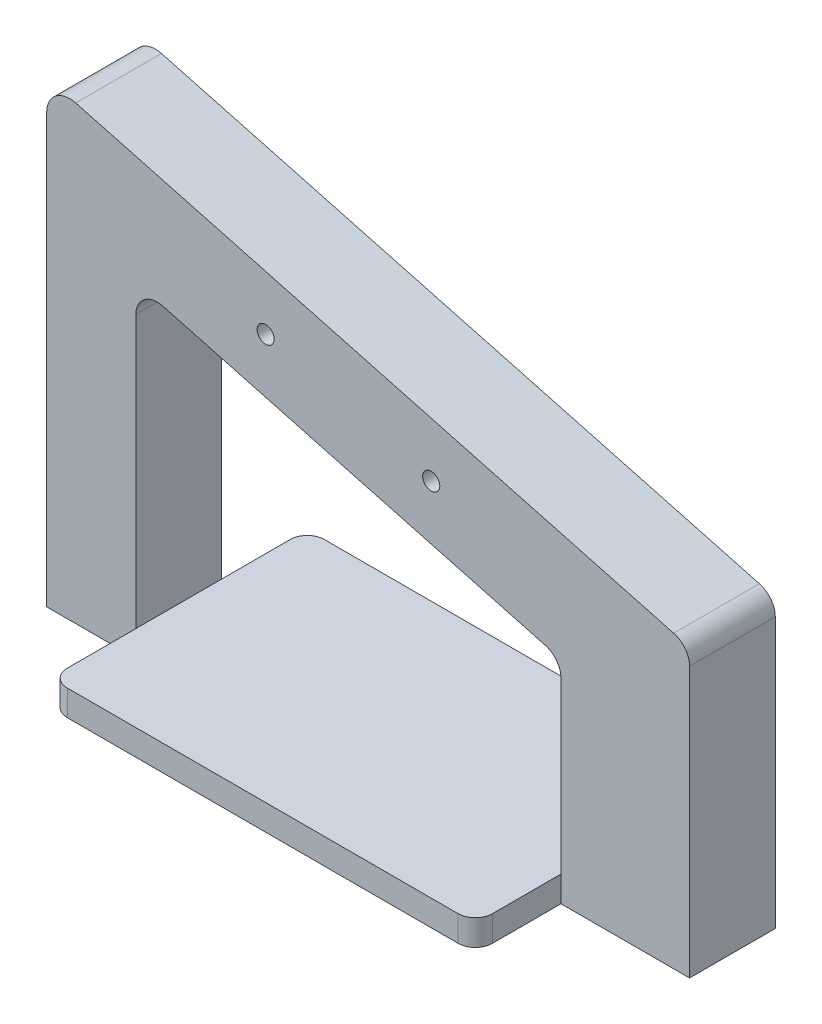
ISO-10303-21;
HEADER;
FILE_DESCRIPTION(('STEP AP214'),'2;1');
FILE_NAME('part.step','',(''),(''),'','','');
FILE_SCHEMA(('AUTOMOTIVE_DESIGN { 1 0 10303 214 1 1 1 1 }'));
ENDSEC;
DATA;
#1=APPLICATION_CONTEXT('core data for automotive mechanical design processes');
#2=APPLICATION_PROTOCOL_DEFINITION('international standard','automotive_design',2000,#1);
#3=PRODUCT_CONTEXT('',#1,'mechanical');
#4=PRODUCT('Part','Part','',(#3));
#5=PRODUCT_RELATED_PRODUCT_CATEGORY('part','',(#4));
#6=PRODUCT_DEFINITION_FORMATION('','',#4);
#7=PRODUCT_DEFINITION_CONTEXT('part definition',#1,'design');
#8=PRODUCT_DEFINITION('design','',#6,#7);
#9=PRODUCT_DEFINITION_SHAPE('','',#8);
#10=(LENGTH_UNIT() NAMED_UNIT(*) SI_UNIT(.MILLI.,.METRE.));
#11=(NAMED_UNIT(*) PLANE_ANGLE_UNIT() SI_UNIT($,.RADIAN.));
#12=(NAMED_UNIT(*) SI_UNIT($,.STERADIAN.) SOLID_ANGLE_UNIT());
#13=UNCERTAINTY_MEASURE_WITH_UNIT(LENGTH_MEASURE(1.E-05),#10,'distance_accuracy_value','');
#14=(GEOMETRIC_REPRESENTATION_CONTEXT(3) GLOBAL_UNCERTAINTY_ASSIGNED_CONTEXT((#13)) GLOBAL_UNIT_ASSIGNED_CONTEXT((#10,
#11,#12)) REPRESENTATION_CONTEXT('',''));
#15=CARTESIAN_POINT('',(0.,0.,0.));
#16=DIRECTION('',(0.,0.,1.));
#17=DIRECTION('',(1.,0.,0.));
#18=AXIS2_PLACEMENT_3D('',#15,#16,#17);
#19=CARTESIAN_POINT('',(82.55,72.3797208240468,25.4));
#20=DIRECTION('',(0.,0.,-1.));
#21=DIRECTION('',(-1.,0.,0.));
#22=AXIS2_PLACEMENT_3D('',#19,#20,#21);
#23=PLANE('',#22);
#24=CARTESIAN_POINT('',(-36.7282723305372,94.7545594602727,25.4));
#25=DIRECTION('',(0.,0.,1.));
#26=DIRECTION('',(1.,0.,0.));
#27=AXIS2_PLACEMENT_3D('',#24,#25,#26);
#28=CIRCLE('',#27,2.54);
#29=CARTESIAN_POINT('',(-34.1882723305372,94.7545594602727,25.4));
#30=VERTEX_POINT('',#29);
#31=EDGE_CURVE('E361',#30,#30,#28,.T.);
#32=ORIENTED_EDGE('',*,*,#31,.F.);
#33=EDGE_LOOP('',(#32));
#34=FACE_BOUND('',#33,.T.);
#35=CARTESIAN_POINT('',(12.3407596449475,81.606551969065,25.4));
#36=DIRECTION('',(0.,0.,1.));
#37=DIRECTION('',(1.,0.,0.));
#38=AXIS2_PLACEMENT_3D('',#35,#36,#37);
#39=CIRCLE('',#38,2.54);
#40=CARTESIAN_POINT('',(14.8807596449475,81.606551969065,25.4));
#41=VERTEX_POINT('',#40);
#42=EDGE_CURVE('E365',#41,#41,#39,.T.);
#43=ORIENTED_EDGE('',*,*,#42,.F.);
#44=EDGE_LOOP('',(#43));
#45=FACE_BOUND('',#44,.T.);
#46=DIRECTION('',(0.,1.,0.));
#47=VECTOR('',#46,1.);
#48=CARTESIAN_POINT('',(50.8,0.,25.4));
#49=LINE('',#48,#47);
#50=CARTESIAN_POINT('',(50.8,-7.61999999999999,25.4));
#51=VERTEX_POINT('',#50);
#52=CARTESIAN_POINT('',(50.8,0.,25.4));
#53=VERTEX_POINT('',#52);
#54=EDGE_CURVE('E240',#51,#53,#49,.T.);
#55=ORIENTED_EDGE('',*,*,#54,.F.);
#56=DIRECTION('',(1.,0.,0.));
#57=VECTOR('',#56,1.);
#58=CARTESIAN_POINT('',(0.,-7.62,25.4));
#59=LINE('',#58,#57);
#60=CARTESIAN_POINT('',(88.9,-7.62,25.4));
#61=VERTEX_POINT('',#60);
#62=EDGE_CURVE('E294',#51,#61,#59,.T.);
#63=ORIENTED_EDGE('',*,*,#62,.T.);
#64=DIRECTION('',(0.,1.,0.));
#65=VECTOR('',#64,1.);
#66=CARTESIAN_POINT('',(88.9,-7.62,25.4));
#67=LINE('',#66,#65);
#68=CARTESIAN_POINT('',(88.8999999999997,72.3797208240456,25.4));
#69=VERTEX_POINT('',#68);
#70=EDGE_CURVE('E298',#61,#69,#67,.T.);
#71=ORIENTED_EDGE('',*,*,#70,.T.);
#72=CARTESIAN_POINT('',(82.55,72.3797208240468,25.4));
#73=DIRECTION('',(0.,0.,1.));
#74=DIRECTION('',(-1.,0.,0.));
#75=AXIS2_PLACEMENT_3D('',#72,#73,#74);
#76=CIRCLE('',#75,6.3499999999992);
#77=CARTESIAN_POINT('',(84.1935009364007,78.5133498209812,25.4));
#78=VERTEX_POINT('',#77);
#79=EDGE_CURVE('E284',#69,#78,#76,.T.);
#80=ORIENTED_EDGE('',*,*,#79,.T.);
#81=DIRECTION('',(-0.965925826289068,0.258819045102521,0.));
#82=VECTOR('',#81,1.);
#83=CARTESIAN_POINT('',(84.1935009364007,78.5133498209812,25.4));
#84=LINE('',#83,#82);
#85=CARTESIAN_POINT('',(-92.9872563432215,125.988790648391,25.4));
#86=VERTEX_POINT('',#85);
#87=EDGE_CURVE('E287',#78,#86,#84,.T.);
#88=ORIENTED_EDGE('',*,*,#87,.T.);
#89=CARTESIAN_POINT('',(-94.7580764604042,119.38,25.4));
#90=DIRECTION('',(0.,0.,1.));
#91=DIRECTION('',(-1.,0.,0.));
#92=AXIS2_PLACEMENT_3D('',#89,#90,#91);
#93=CIRCLE('',#92,6.84192353959584);
#94=CARTESIAN_POINT('',(-101.6,119.38,25.4));
#95=VERTEX_POINT('',#94);
#96=EDGE_CURVE('E290',#86,#95,#93,.T.);
#97=ORIENTED_EDGE('',*,*,#96,.T.);
#98=DIRECTION('',(0.,-1.,0.));
#99=VECTOR('',#98,1.);
#100=CARTESIAN_POINT('',(-101.6,-7.62000000000002,25.4));
#101=LINE('',#100,#99);
#102=CARTESIAN_POINT('',(-101.6,-7.62000000000002,25.4));
#103=VERTEX_POINT('',#102);
#104=EDGE_CURVE('E292',#95,#103,#101,.T.);
#105=ORIENTED_EDGE('',*,*,#104,.T.);
#106=CARTESIAN_POINT('',(-75.1875126855897,-7.62000000000001,25.4));
#107=VERTEX_POINT('',#106);
#108=EDGE_CURVE('E295',#103,#107,#59,.T.);
#109=ORIENTED_EDGE('',*,*,#108,.T.);
#110=DIRECTION('',(0.,-1.,0.));
#111=VECTOR('',#110,1.);
#112=CARTESIAN_POINT('',(-75.1875126855897,0.,25.4));
#113=LINE('',#112,#111);
#114=CARTESIAN_POINT('',(-75.1875126855897,0.,25.4));
#115=VERTEX_POINT('',#114);
#116=EDGE_CURVE('E235',#115,#107,#113,.T.);
#117=ORIENTED_EDGE('',*,*,#116,.F.);
#118=DIRECTION('',(0.,-1.,0.));
#119=VECTOR('',#118,1.);
#120=CARTESIAN_POINT('',(-75.1875126855897,0.,25.4));
#121=LINE('',#120,#119);
#122=CARTESIAN_POINT('',(-75.1875126855897,80.6245188824583,25.4));
#123=VERTEX_POINT('',#122);
#124=EDGE_CURVE('E216',#123,#115,#121,.T.);
#125=ORIENTED_EDGE('',*,*,#124,.F.);
#126=CARTESIAN_POINT('',(-68.8375126855897,80.6245188824583,25.4));
#127=DIRECTION('',(0.,0.,1.));
#128=DIRECTION('',(-1.,0.,0.));
#129=AXIS2_PLACEMENT_3D('',#126,#127,#128);
#130=CIRCLE('',#129,6.35);
#131=CARTESIAN_POINT('',(-67.1940117491886,86.7581478793939,25.4));
#132=VERTEX_POINT('',#131);
#133=EDGE_CURVE('E261',#132,#123,#130,.T.);
#134=ORIENTED_EDGE('',*,*,#133,.F.);
#135=DIRECTION('',(-0.965925826289068,0.258819045102521,0.));
#136=VECTOR('',#135,1.);
#137=CARTESIAN_POINT('',(-67.1940117491886,86.7581478793939,25.4));
#138=LINE('',#137,#136);
#139=CARTESIAN_POINT('',(46.093500936401,56.4028503427596,25.4));
#140=VERTEX_POINT('',#139);
#141=EDGE_CURVE('E259',#140,#132,#138,.T.);
#142=ORIENTED_EDGE('',*,*,#141,.F.);
#143=CARTESIAN_POINT('',(44.45,50.269221345824,25.4));
#144=DIRECTION('',(0.,0.,1.));
#145=DIRECTION('',(-1.,0.,0.));
#146=AXIS2_PLACEMENT_3D('',#143,#144,#145);
#147=CIRCLE('',#146,6.35);
#148=CARTESIAN_POINT('',(50.8,50.2692213458239,25.4));
#149=VERTEX_POINT('',#148);
#150=EDGE_CURVE('E257',#149,#140,#147,.T.);
#151=ORIENTED_EDGE('',*,*,#150,.F.);
#152=DIRECTION('',(0.,1.,0.));
#153=VECTOR('',#152,1.);
#154=CARTESIAN_POINT('',(50.8,50.2692213458239,25.4));
#155=LINE('',#154,#153);
#156=EDGE_CURVE('E211',#53,#149,#155,.T.);
#157=ORIENTED_EDGE('',*,*,#156,.F.);
#158=EDGE_LOOP('',(#55,#63,#71,#80,#88,#97,#105,#109,#117,#125,#134,#142,#151,#157));
#159=FACE_BOUND('',#158,.T.);
#160=ADVANCED_FACE('F36',(#34,#45,#159),#23,.F.);
#161=CARTESIAN_POINT('',(82.55,72.3797208240468,0.));
#162=DIRECTION('',(0.,0.,-1.));
#163=DIRECTION('',(-1.,0.,0.));
#164=AXIS2_PLACEMENT_3D('',#161,#162,#163);
#165=PLANE('',#164);
#166=CARTESIAN_POINT('',(-36.7282723305372,94.7545594602727,0.));
#167=DIRECTION('',(0.,0.,-1.));
#168=DIRECTION('',(-1.,0.,0.));
#169=AXIS2_PLACEMENT_3D('',#166,#167,#168);
#170=CIRCLE('',#169,2.54);
#171=CARTESIAN_POINT('',(-39.2682723305372,94.7545594602727,0.));
#172=VERTEX_POINT('',#171);
#173=EDGE_CURVE('E40',#172,#172,#170,.T.);
#174=ORIENTED_EDGE('',*,*,#173,.F.);
#175=EDGE_LOOP('',(#174));
#176=FACE_BOUND('',#175,.T.);
#177=CARTESIAN_POINT('',(12.3407596449475,81.606551969065,0.));
#178=DIRECTION('',(0.,0.,-1.));
#179=DIRECTION('',(-1.,0.,0.));
#180=AXIS2_PLACEMENT_3D('',#177,#178,#179);
#181=CIRCLE('',#180,2.54);
#182=CARTESIAN_POINT('',(9.80075964494752,81.606551969065,0.));
#183=VERTEX_POINT('',#182);
#184=EDGE_CURVE('E226',#183,#183,#181,.T.);
#185=ORIENTED_EDGE('',*,*,#184,.F.);
#186=EDGE_LOOP('',(#185));
#187=FACE_BOUND('',#186,.T.);
#188=DIRECTION('',(0.,-1.,0.));
#189=VECTOR('',#188,1.);
#190=CARTESIAN_POINT('',(50.8,0.,0.));
#191=LINE('',#190,#189);
#192=CARTESIAN_POINT('',(50.8,0.,0.));
#193=VERTEX_POINT('',#192);
#194=CARTESIAN_POINT('',(50.8,-7.62,0.));
#195=VERTEX_POINT('',#194);
#196=EDGE_CURVE('E220',#193,#195,#191,.T.);
#197=ORIENTED_EDGE('',*,*,#196,.F.);
#198=DIRECTION('',(0.,1.,0.));
#199=VECTOR('',#198,1.);
#200=CARTESIAN_POINT('',(50.8,50.2692213458239,0.));
#201=LINE('',#200,#199);
#202=CARTESIAN_POINT('',(50.8,50.2692213458239,0.));
#203=VERTEX_POINT('',#202);
#204=EDGE_CURVE('E255',#193,#203,#201,.T.);
#205=ORIENTED_EDGE('',*,*,#204,.T.);
#206=CARTESIAN_POINT('',(44.45,50.269221345824,0.));
#207=DIRECTION('',(0.,0.,1.));
#208=DIRECTION('',(-1.,0.,0.));
#209=AXIS2_PLACEMENT_3D('',#206,#207,#208);
#210=CIRCLE('',#209,6.35);
#211=CARTESIAN_POINT('',(46.093500936401,56.4028503427596,0.));
#212=VERTEX_POINT('',#211);
#213=EDGE_CURVE('E267',#203,#212,#210,.T.);
#214=ORIENTED_EDGE('',*,*,#213,.T.);
#215=DIRECTION('',(-0.965925826289068,0.258819045102521,0.));
#216=VECTOR('',#215,1.);
#217=CARTESIAN_POINT('',(-67.1940117491886,86.7581478793939,0.));
#218=LINE('',#217,#216);
#219=CARTESIAN_POINT('',(-67.1940117491886,86.7581478793939,0.));
#220=VERTEX_POINT('',#219);
#221=EDGE_CURVE('E270',#212,#220,#218,.T.);
#222=ORIENTED_EDGE('',*,*,#221,.T.);
#223=CARTESIAN_POINT('',(-68.8375126855897,80.6245188824583,0.));
#224=DIRECTION('',(0.,0.,1.));
#225=DIRECTION('',(-1.,0.,0.));
#226=AXIS2_PLACEMENT_3D('',#223,#224,#225);
#227=CIRCLE('',#226,6.35);
#228=CARTESIAN_POINT('',(-75.1875126855897,80.6245188824583,0.));
#229=VERTEX_POINT('',#228);
#230=EDGE_CURVE('E209',#220,#229,#227,.T.);
#231=ORIENTED_EDGE('',*,*,#230,.T.);
#232=DIRECTION('',(0.,-1.,0.));
#233=VECTOR('',#232,1.);
#234=CARTESIAN_POINT('',(-75.1875126855897,0.,0.));
#235=LINE('',#234,#233);
#236=CARTESIAN_POINT('',(-75.1875126855897,0.,0.));
#237=VERTEX_POINT('',#236);
#238=EDGE_CURVE('E202',#229,#237,#235,.T.);
#239=ORIENTED_EDGE('',*,*,#238,.T.);
#240=DIRECTION('',(0.,1.,0.));
#241=VECTOR('',#240,1.);
#242=CARTESIAN_POINT('',(-75.1875126855897,-7.62000000000001,0.));
#243=LINE('',#242,#241);
#244=CARTESIAN_POINT('',(-75.1875126855897,-7.62,0.));
#245=VERTEX_POINT('',#244);
#246=EDGE_CURVE('E205',#245,#237,#243,.T.);
#247=ORIENTED_EDGE('',*,*,#246,.F.);
#248=DIRECTION('',(1.,0.,0.));
#249=VECTOR('',#248,1.);
#250=CARTESIAN_POINT('',(0.,-7.62,0.));
#251=LINE('',#250,#249);
#252=CARTESIAN_POINT('',(-101.6,-7.62000000000002,0.));
#253=VERTEX_POINT('',#252);
#254=EDGE_CURVE('E311',#253,#245,#251,.T.);
#255=ORIENTED_EDGE('',*,*,#254,.F.);
#256=DIRECTION('',(0.,-1.,0.));
#257=VECTOR('',#256,1.);
#258=CARTESIAN_POINT('',(-101.6,-7.62000000000002,0.));
#259=LINE('',#258,#257);
#260=CARTESIAN_POINT('',(-101.6,119.38,0.));
#261=VERTEX_POINT('',#260);
#262=EDGE_CURVE('E307',#261,#253,#259,.T.);
#263=ORIENTED_EDGE('',*,*,#262,.F.);
#264=CARTESIAN_POINT('',(-94.7580764604042,119.38,0.));
#265=DIRECTION('',(0.,0.,1.));
#266=DIRECTION('',(-1.,0.,0.));
#267=AXIS2_PLACEMENT_3D('',#264,#265,#266);
#268=CIRCLE('',#267,6.84192353959584);
#269=CARTESIAN_POINT('',(-92.9872563432215,125.988790648391,0.));
#270=VERTEX_POINT('',#269);
#271=EDGE_CURVE('E305',#270,#261,#268,.T.);
#272=ORIENTED_EDGE('',*,*,#271,.F.);
#273=DIRECTION('',(-0.965925826289068,0.258819045102521,0.));
#274=VECTOR('',#273,1.);
#275=CARTESIAN_POINT('',(84.1935009364007,78.5133498209812,0.));
#276=LINE('',#275,#274);
#277=CARTESIAN_POINT('',(84.1935009364007,78.5133498209812,0.));
#278=VERTEX_POINT('',#277);
#279=EDGE_CURVE('E303',#278,#270,#276,.T.);
#280=ORIENTED_EDGE('',*,*,#279,.F.);
#281=CARTESIAN_POINT('',(82.55,72.3797208240468,0.));
#282=DIRECTION('',(0.,0.,1.));
#283=DIRECTION('',(-1.,0.,0.));
#284=AXIS2_PLACEMENT_3D('',#281,#282,#283);
#285=CIRCLE('',#284,6.3499999999992);
#286=CARTESIAN_POINT('',(88.8999999999997,72.3797208240456,0.));
#287=VERTEX_POINT('',#286);
#288=EDGE_CURVE('E283',#287,#278,#285,.T.);
#289=ORIENTED_EDGE('',*,*,#288,.F.);
#290=DIRECTION('',(0.,1.,0.));
#291=VECTOR('',#290,1.);
#292=CARTESIAN_POINT('',(88.9,-7.62,0.));
#293=LINE('',#292,#291);
#294=CARTESIAN_POINT('',(88.9,-7.62,0.));
#295=VERTEX_POINT('',#294);
#296=EDGE_CURVE('E288',#295,#287,#293,.T.);
#297=ORIENTED_EDGE('',*,*,#296,.F.);
#298=EDGE_CURVE('E310',#195,#295,#251,.T.);
#299=ORIENTED_EDGE('',*,*,#298,.F.);
#300=EDGE_LOOP('',(#197,#205,#214,#222,#231,#239,#247,#255,#263,#272,#280,#289,#297,#299));
#301=FACE_BOUND('',#300,.T.);
#302=ADVANCED_FACE('F204',(#176,#187,#301),#165,.T.);
#303=CARTESIAN_POINT('',(82.55,72.3797208240468,25.4));
#304=DIRECTION('',(0.,0.,-1.));
#305=DIRECTION('',(-1.,0.,0.));
#306=AXIS2_PLACEMENT_3D('',#303,#304,#305);
#307=CYLINDRICAL_SURFACE('',#306,6.3499999999992);
#308=ORIENTED_EDGE('',*,*,#288,.T.);
#309=DIRECTION('',(0.,0.,-1.));
#310=VECTOR('',#309,1.);
#311=CARTESIAN_POINT('',(84.1935009364007,78.5133498209812,25.4));
#312=LINE('',#311,#310);
#313=EDGE_CURVE('E328',#78,#278,#312,.T.);
#314=ORIENTED_EDGE('',*,*,#313,.F.);
#315=ORIENTED_EDGE('',*,*,#79,.F.);
#316=DIRECTION('',(0.,0.,-1.));
#317=VECTOR('',#316,1.);
#318=CARTESIAN_POINT('',(88.8999999999997,72.3797208240456,25.4));
#319=LINE('',#318,#317);
#320=EDGE_CURVE('E300',#69,#287,#319,.T.);
#321=ORIENTED_EDGE('',*,*,#320,.T.);
#322=EDGE_LOOP('',(#308,#314,#315,#321));
#323=FACE_BOUND('',#322,.T.);
#324=ADVANCED_FACE('F441',(#323),#307,.T.);
#325=CARTESIAN_POINT('',(84.1935009364007,78.5133498209812,25.4));
#326=DIRECTION('',(-0.258819045102521,-0.965925826289068,0.));
#327=DIRECTION('',(0.965925826289068,-0.258819045102521,0.));
#328=AXIS2_PLACEMENT_3D('',#325,#326,#327);
#329=PLANE('',#328);
#330=ORIENTED_EDGE('',*,*,#279,.T.);
#331=DIRECTION('',(0.,0.,-1.));
#332=VECTOR('',#331,1.);
#333=CARTESIAN_POINT('',(-92.9872563432215,125.988790648391,25.4));
#334=LINE('',#333,#332);
#335=EDGE_CURVE('E325',#86,#270,#334,.T.);
#336=ORIENTED_EDGE('',*,*,#335,.F.);
#337=ORIENTED_EDGE('',*,*,#87,.F.);
#338=ORIENTED_EDGE('',*,*,#313,.T.);
#339=EDGE_LOOP('',(#330,#336,#337,#338));
#340=FACE_BOUND('',#339,.T.);
#341=ADVANCED_FACE('F439',(#340),#329,.F.);
#342=CARTESIAN_POINT('',(-94.7580764604042,119.38,25.4));
#343=DIRECTION('',(0.,0.,-1.));
#344=DIRECTION('',(-1.,0.,0.));
#345=AXIS2_PLACEMENT_3D('',#342,#343,#344);
#346=CYLINDRICAL_SURFACE('',#345,6.84192353959584);
#347=ORIENTED_EDGE('',*,*,#271,.T.);
#348=DIRECTION('',(0.,0.,-1.));
#349=VECTOR('',#348,1.);
#350=CARTESIAN_POINT('',(-101.6,119.38,25.4));
#351=LINE('',#350,#349);
#352=EDGE_CURVE('E322',#95,#261,#351,.T.);
#353=ORIENTED_EDGE('',*,*,#352,.F.);
#354=ORIENTED_EDGE('',*,*,#96,.F.);
#355=ORIENTED_EDGE('',*,*,#335,.T.);
#356=EDGE_LOOP('',(#347,#353,#354,#355));
#357=FACE_BOUND('',#356,.T.);
#358=ADVANCED_FACE('F435',(#357),#346,.T.);
#359=CARTESIAN_POINT('',(-101.6,-7.62000000000002,25.4));
#360=DIRECTION('',(1.,0.,0.));
#361=DIRECTION('',(0.,0.,-1.));
#362=AXIS2_PLACEMENT_3D('',#359,#360,#361);
#363=PLANE('',#362);
#364=ORIENTED_EDGE('',*,*,#262,.T.);
#365=DIRECTION('',(0.,0.,-1.));
#366=VECTOR('',#365,1.);
#367=CARTESIAN_POINT('',(-101.6,-7.62000000000002,25.4));
#368=LINE('',#367,#366);
#369=EDGE_CURVE('E319',#103,#253,#368,.T.);
#370=ORIENTED_EDGE('',*,*,#369,.F.);
#371=ORIENTED_EDGE('',*,*,#104,.F.);
#372=ORIENTED_EDGE('',*,*,#352,.T.);
#373=EDGE_LOOP('',(#364,#370,#371,#372));
#374=FACE_BOUND('',#373,.T.);
#375=ADVANCED_FACE('F430',(#374),#363,.F.);
#376=CARTESIAN_POINT('',(0.,-7.62,25.4));
#377=DIRECTION('',(0.,1.,0.));
#378=DIRECTION('',(0.,0.,1.));
#379=AXIS2_PLACEMENT_3D('',#376,#377,#378);
#380=PLANE('',#379);
#381=DIRECTION('',(0.,0.,1.));
#382=VECTOR('',#381,1.);
#383=CARTESIAN_POINT('',(-75.1875126855897,-7.62000000000001,-25.4));
#384=LINE('',#383,#382);
#385=CARTESIAN_POINT('',(-75.1875126855897,-7.62000000000001,-20.32));
#386=VERTEX_POINT('',#385);
#387=EDGE_CURVE('E195',#386,#245,#384,.T.);
#388=ORIENTED_EDGE('',*,*,#387,.F.);
#389=CARTESIAN_POINT('',(-70.1075126855897,-7.62,-20.32));
#390=DIRECTION('',(0.,1.,0.));
#391=DIRECTION('',(0.,0.,1.));
#392=AXIS2_PLACEMENT_3D('',#389,#390,#391);
#393=CIRCLE('',#392,5.08);
#394=CARTESIAN_POINT('',(-70.1075126855897,-7.62000000000001,-25.4));
#395=VERTEX_POINT('',#394);
#396=EDGE_CURVE('E45',#386,#395,#393,.F.);
#397=ORIENTED_EDGE('',*,*,#396,.T.);
#398=DIRECTION('',(-1.,0.,0.));
#399=VECTOR('',#398,1.);
#400=CARTESIAN_POINT('',(50.8,-7.62,-25.4));
#401=LINE('',#400,#399);
#402=CARTESIAN_POINT('',(45.72,-7.62,-25.4));
#403=VERTEX_POINT('',#402);
#404=EDGE_CURVE('E223',#403,#395,#401,.T.);
#405=ORIENTED_EDGE('',*,*,#404,.F.);
#406=CARTESIAN_POINT('',(45.72,-7.62,-20.32));
#407=DIRECTION('',(0.,1.,0.));
#408=DIRECTION('',(0.,0.,1.));
#409=AXIS2_PLACEMENT_3D('',#406,#407,#408);
#410=CIRCLE('',#409,5.08);
#411=CARTESIAN_POINT('',(50.8,-7.62,-20.32));
#412=VERTEX_POINT('',#411);
#413=EDGE_CURVE('E53',#403,#412,#410,.F.);
#414=ORIENTED_EDGE('',*,*,#413,.T.);
#415=DIRECTION('',(0.,0.,1.));
#416=VECTOR('',#415,1.);
#417=CARTESIAN_POINT('',(50.8,-7.62,-25.4));
#418=LINE('',#417,#416);
#419=EDGE_CURVE('E231',#412,#195,#418,.T.);
#420=ORIENTED_EDGE('',*,*,#419,.T.);
#421=ORIENTED_EDGE('',*,*,#298,.T.);
#422=DIRECTION('',(0.,0.,-1.));
#423=VECTOR('',#422,1.);
#424=CARTESIAN_POINT('',(88.9,-7.62,25.4));
#425=LINE('',#424,#423);
#426=EDGE_CURVE('E316',#61,#295,#425,.T.);
#427=ORIENTED_EDGE('',*,*,#426,.F.);
#428=ORIENTED_EDGE('',*,*,#62,.F.);
#429=DIRECTION('',(0.,0.,-1.));
#430=VECTOR('',#429,1.);
#431=CARTESIAN_POINT('',(50.8,-7.62,50.8));
#432=LINE('',#431,#430);
#433=CARTESIAN_POINT('',(50.8,-7.62,45.72));
#434=VERTEX_POINT('',#433);
#435=EDGE_CURVE('E249',#434,#51,#432,.T.);
#436=ORIENTED_EDGE('',*,*,#435,.F.);
#437=CARTESIAN_POINT('',(45.72,-7.62,45.72));
#438=DIRECTION('',(0.,1.,0.));
#439=DIRECTION('',(0.,0.,1.));
#440=AXIS2_PLACEMENT_3D('',#437,#438,#439);
#441=CIRCLE('',#440,5.08);
#442=CARTESIAN_POINT('',(45.72,-7.62,50.8));
#443=VERTEX_POINT('',#442);
#444=EDGE_CURVE('E337',#434,#443,#441,.F.);
#445=ORIENTED_EDGE('',*,*,#444,.T.);
#446=DIRECTION('',(1.,0.,0.));
#447=VECTOR('',#446,1.);
#448=CARTESIAN_POINT('',(-75.1875126855897,-7.62000000000001,50.8));
#449=LINE('',#448,#447);
#450=CARTESIAN_POINT('',(-70.1075126855897,-7.62000000000001,50.8));
#451=VERTEX_POINT('',#450);
#452=EDGE_CURVE('E239',#451,#443,#449,.T.);
#453=ORIENTED_EDGE('',*,*,#452,.F.);
#454=CARTESIAN_POINT('',(-70.1075126855897,-7.62,45.72));
#455=DIRECTION('',(0.,1.,0.));
#456=DIRECTION('',(0.,0.,1.));
#457=AXIS2_PLACEMENT_3D('',#454,#455,#456);
#458=CIRCLE('',#457,5.08);
#459=CARTESIAN_POINT('',(-75.1875126855897,-7.62000000000001,45.72));
#460=VERTEX_POINT('',#459);
#461=EDGE_CURVE('E339',#451,#460,#458,.F.);
#462=ORIENTED_EDGE('',*,*,#461,.T.);
#463=DIRECTION('',(0.,0.,-1.));
#464=VECTOR('',#463,1.);
#465=CARTESIAN_POINT('',(-75.1875126855897,-7.62000000000001,50.8));
#466=LINE('',#465,#464);
#467=EDGE_CURVE('E251',#460,#107,#466,.T.);
#468=ORIENTED_EDGE('',*,*,#467,.T.);
#469=ORIENTED_EDGE('',*,*,#108,.F.);
#470=ORIENTED_EDGE('',*,*,#369,.T.);
#471=ORIENTED_EDGE('',*,*,#254,.T.);
#472=EDGE_LOOP('',(#388,#397,#405,#414,#420,#421,#427,#428,#436,#445,#453,#462,#468,#469,#470,#471));
#473=FACE_BOUND('',#472,.T.);
#474=ADVANCED_FACE('F395',(#473),#380,.F.);
#475=CARTESIAN_POINT('',(88.9,-7.62,25.4));
#476=DIRECTION('',(-1.,0.,0.));
#477=DIRECTION('',(0.,-1.,0.));
#478=AXIS2_PLACEMENT_3D('',#475,#476,#477);
#479=PLANE('',#478);
#480=ORIENTED_EDGE('',*,*,#296,.T.);
#481=ORIENTED_EDGE('',*,*,#320,.F.);
#482=ORIENTED_EDGE('',*,*,#70,.F.);
#483=ORIENTED_EDGE('',*,*,#426,.T.);
#484=EDGE_LOOP('',(#480,#481,#482,#483));
#485=FACE_BOUND('',#484,.T.);
#486=ADVANCED_FACE('F399',(#485),#479,.F.);
#487=CARTESIAN_POINT('',(0.,0.,25.4));
#488=DIRECTION('',(0.,1.,0.));
#489=DIRECTION('',(0.,0.,1.));
#490=AXIS2_PLACEMENT_3D('',#487,#488,#489);
#491=PLANE('',#490);
#492=DIRECTION('',(1.,0.,0.));
#493=VECTOR('',#492,1.);
#494=CARTESIAN_POINT('',(50.8,0.,-25.4));
#495=LINE('',#494,#493);
#496=CARTESIAN_POINT('',(-70.1075126855897,0.,-25.4));
#497=VERTEX_POINT('',#496);
#498=CARTESIAN_POINT('',(45.72,0.,-25.4));
#499=VERTEX_POINT('',#498);
#500=EDGE_CURVE('E228',#497,#499,#495,.T.);
#501=ORIENTED_EDGE('',*,*,#500,.F.);
#502=CARTESIAN_POINT('',(-70.1075126855897,0.,-20.32));
#503=DIRECTION('',(0.,1.,0.));
#504=DIRECTION('',(0.,0.,1.));
#505=AXIS2_PLACEMENT_3D('',#502,#503,#504);
#506=CIRCLE('',#505,5.08);
#507=CARTESIAN_POINT('',(-75.1875126855897,0.,-20.32));
#508=VERTEX_POINT('',#507);
#509=EDGE_CURVE('E193',#497,#508,#506,.T.);
#510=ORIENTED_EDGE('',*,*,#509,.T.);
#511=DIRECTION('',(0.,0.,1.));
#512=VECTOR('',#511,1.);
#513=CARTESIAN_POINT('',(-75.1875126855897,0.,-25.4));
#514=LINE('',#513,#512);
#515=EDGE_CURVE('E186',#508,#237,#514,.T.);
#516=ORIENTED_EDGE('',*,*,#515,.T.);
#517=DIRECTION('',(0.,0.,-1.));
#518=VECTOR('',#517,1.);
#519=CARTESIAN_POINT('',(-75.1875126855897,0.,25.4));
#520=LINE('',#519,#518);
#521=EDGE_CURVE('E192',#115,#237,#520,.T.);
#522=ORIENTED_EDGE('',*,*,#521,.F.);
#523=DIRECTION('',(0.,0.,-1.));
#524=VECTOR('',#523,1.);
#525=CARTESIAN_POINT('',(-75.1875126855897,0.,50.8));
#526=LINE('',#525,#524);
#527=CARTESIAN_POINT('',(-75.1875126855897,0.,45.72));
#528=VERTEX_POINT('',#527);
#529=EDGE_CURVE('E253',#528,#115,#526,.T.);
#530=ORIENTED_EDGE('',*,*,#529,.F.);
#531=CARTESIAN_POINT('',(-70.1075126855897,0.,45.72));
#532=DIRECTION('',(0.,1.,0.));
#533=DIRECTION('',(0.,0.,1.));
#534=AXIS2_PLACEMENT_3D('',#531,#532,#533);
#535=CIRCLE('',#534,5.08);
#536=CARTESIAN_POINT('',(-70.1075126855897,0.,50.8));
#537=VERTEX_POINT('',#536);
#538=EDGE_CURVE('E345',#528,#537,#535,.T.);
#539=ORIENTED_EDGE('',*,*,#538,.T.);
#540=DIRECTION('',(-1.,0.,0.));
#541=VECTOR('',#540,1.);
#542=CARTESIAN_POINT('',(-75.1875126855897,0.,50.8));
#543=LINE('',#542,#541);
#544=CARTESIAN_POINT('',(45.72,0.,50.8));
#545=VERTEX_POINT('',#544);
#546=EDGE_CURVE('E236',#545,#537,#543,.T.);
#547=ORIENTED_EDGE('',*,*,#546,.F.);
#548=CARTESIAN_POINT('',(45.72,0.,45.72));
#549=DIRECTION('',(0.,1.,0.));
#550=DIRECTION('',(0.,0.,1.));
#551=AXIS2_PLACEMENT_3D('',#548,#549,#550);
#552=CIRCLE('',#551,5.08);
#553=CARTESIAN_POINT('',(50.8,0.,45.72));
#554=VERTEX_POINT('',#553);
#555=EDGE_CURVE('E343',#545,#554,#552,.T.);
#556=ORIENTED_EDGE('',*,*,#555,.T.);
#557=DIRECTION('',(0.,0.,-1.));
#558=VECTOR('',#557,1.);
#559=CARTESIAN_POINT('',(50.8,0.,50.8));
#560=LINE('',#559,#558);
#561=EDGE_CURVE('E243',#554,#53,#560,.T.);
#562=ORIENTED_EDGE('',*,*,#561,.T.);
#563=DIRECTION('',(0.,0.,-1.));
#564=VECTOR('',#563,1.);
#565=CARTESIAN_POINT('',(50.8,0.,25.4));
#566=LINE('',#565,#564);
#567=EDGE_CURVE('E280',#53,#193,#566,.T.);
#568=ORIENTED_EDGE('',*,*,#567,.T.);
#569=DIRECTION('',(0.,0.,1.));
#570=VECTOR('',#569,1.);
#571=CARTESIAN_POINT('',(50.8,0.,-25.4));
#572=LINE('',#571,#570);
#573=CARTESIAN_POINT('',(50.8,0.,-20.32));
#574=VERTEX_POINT('',#573);
#575=EDGE_CURVE('E196',#574,#193,#572,.T.);
#576=ORIENTED_EDGE('',*,*,#575,.F.);
#577=CARTESIAN_POINT('',(45.72,0.,-20.32));
#578=DIRECTION('',(0.,1.,0.));
#579=DIRECTION('',(0.,0.,1.));
#580=AXIS2_PLACEMENT_3D('',#577,#578,#579);
#581=CIRCLE('',#580,5.08);
#582=EDGE_CURVE('E355',#574,#499,#581,.T.);
#583=ORIENTED_EDGE('',*,*,#582,.T.);
#584=EDGE_LOOP('',(#501,#510,#516,#522,#530,#539,#547,#556,#562,#568,#576,#583));
#585=FACE_BOUND('',#584,.T.);
#586=ADVANCED_FACE('F189',(#585),#491,.T.);
#587=CARTESIAN_POINT('',(50.8,50.2692213458239,25.4));
#588=DIRECTION('',(-1.,0.,0.));
#589=DIRECTION('',(0.,-1.,0.));
#590=AXIS2_PLACEMENT_3D('',#587,#588,#589);
#591=PLANE('',#590);
#592=ORIENTED_EDGE('',*,*,#204,.F.);
#593=ORIENTED_EDGE('',*,*,#567,.F.);
#594=ORIENTED_EDGE('',*,*,#156,.T.);
#595=DIRECTION('',(0.,0.,-1.));
#596=VECTOR('',#595,1.);
#597=CARTESIAN_POINT('',(50.8,50.2692213458239,25.4));
#598=LINE('',#597,#596);
#599=EDGE_CURVE('E278',#149,#203,#598,.T.);
#600=ORIENTED_EDGE('',*,*,#599,.T.);
#601=EDGE_LOOP('',(#592,#593,#594,#600));
#602=FACE_BOUND('',#601,.T.);
#603=ADVANCED_FACE('F388',(#602),#591,.T.);
#604=CARTESIAN_POINT('',(44.45,50.269221345824,25.4));
#605=DIRECTION('',(0.,0.,-1.));
#606=DIRECTION('',(-1.,0.,0.));
#607=AXIS2_PLACEMENT_3D('',#604,#605,#606);
#608=CYLINDRICAL_SURFACE('',#607,6.35);
#609=ORIENTED_EDGE('',*,*,#213,.F.);
#610=ORIENTED_EDGE('',*,*,#599,.F.);
#611=ORIENTED_EDGE('',*,*,#150,.T.);
#612=DIRECTION('',(0.,0.,-1.));
#613=VECTOR('',#612,1.);
#614=CARTESIAN_POINT('',(46.093500936401,56.4028503427596,25.4));
#615=LINE('',#614,#613);
#616=EDGE_CURVE('E276',#140,#212,#615,.T.);
#617=ORIENTED_EDGE('',*,*,#616,.T.);
#618=EDGE_LOOP('',(#609,#610,#611,#617));
#619=FACE_BOUND('',#618,.T.);
#620=ADVANCED_FACE('F499',(#619),#608,.F.);
#621=CARTESIAN_POINT('',(-67.1940117491886,86.7581478793939,25.4));
#622=DIRECTION('',(-0.258819045102521,-0.965925826289068,0.));
#623=DIRECTION('',(0.965925826289068,-0.258819045102521,0.));
#624=AXIS2_PLACEMENT_3D('',#621,#622,#623);
#625=PLANE('',#624);
#626=ORIENTED_EDGE('',*,*,#221,.F.);
#627=ORIENTED_EDGE('',*,*,#616,.F.);
#628=ORIENTED_EDGE('',*,*,#141,.T.);
#629=DIRECTION('',(0.,0.,-1.));
#630=VECTOR('',#629,1.);
#631=CARTESIAN_POINT('',(-67.1940117491886,86.7581478793939,25.4));
#632=LINE('',#631,#630);
#633=EDGE_CURVE('E274',#132,#220,#632,.T.);
#634=ORIENTED_EDGE('',*,*,#633,.T.);
#635=EDGE_LOOP('',(#626,#627,#628,#634));
#636=FACE_BOUND('',#635,.T.);
#637=ADVANCED_FACE('F505',(#636),#625,.T.);
#638=CARTESIAN_POINT('',(-68.8375126855897,80.6245188824583,25.4));
#639=DIRECTION('',(0.,0.,-1.));
#640=DIRECTION('',(-1.,0.,0.));
#641=AXIS2_PLACEMENT_3D('',#638,#639,#640);
#642=CYLINDRICAL_SURFACE('',#641,6.35);
#643=ORIENTED_EDGE('',*,*,#230,.F.);
#644=ORIENTED_EDGE('',*,*,#633,.F.);
#645=ORIENTED_EDGE('',*,*,#133,.T.);
#646=DIRECTION('',(0.,0.,-1.));
#647=VECTOR('',#646,1.);
#648=CARTESIAN_POINT('',(-75.1875126855897,80.6245188824583,25.4));
#649=LINE('',#648,#647);
#650=EDGE_CURVE('E217',#123,#229,#649,.T.);
#651=ORIENTED_EDGE('',*,*,#650,.T.);
#652=EDGE_LOOP('',(#643,#644,#645,#651));
#653=FACE_BOUND('',#652,.T.);
#654=ADVANCED_FACE('F513',(#653),#642,.F.);
#655=CARTESIAN_POINT('',(-75.1875126855897,0.,25.4));
#656=DIRECTION('',(1.,0.,0.));
#657=DIRECTION('',(0.,0.,-1.));
#658=AXIS2_PLACEMENT_3D('',#655,#656,#657);
#659=PLANE('',#658);
#660=ORIENTED_EDGE('',*,*,#238,.F.);
#661=ORIENTED_EDGE('',*,*,#650,.F.);
#662=ORIENTED_EDGE('',*,*,#124,.T.);
#663=ORIENTED_EDGE('',*,*,#521,.T.);
#664=EDGE_LOOP('',(#660,#661,#662,#663));
#665=FACE_BOUND('',#664,.T.);
#666=ADVANCED_FACE('F214',(#665),#659,.T.);
#667=CARTESIAN_POINT('',(-75.1875126855897,0.,50.8));
#668=DIRECTION('',(1.,0.,0.));
#669=DIRECTION('',(0.,0.,-1.));
#670=AXIS2_PLACEMENT_3D('',#667,#668,#669);
#671=PLANE('',#670);
#672=ORIENTED_EDGE('',*,*,#467,.F.);
#673=DIRECTION('',(0.,-1.,0.));
#674=VECTOR('',#673,1.);
#675=CARTESIAN_POINT('',(-75.1875126855897,0.,45.72));
#676=LINE('',#675,#674);
#677=EDGE_CURVE('E341',#460,#528,#676,.F.);
#678=ORIENTED_EDGE('',*,*,#677,.T.);
#679=ORIENTED_EDGE('',*,*,#529,.T.);
#680=ORIENTED_EDGE('',*,*,#116,.T.);
#681=EDGE_LOOP('',(#672,#678,#679,#680));
#682=FACE_BOUND('',#681,.T.);
#683=ADVANCED_FACE('F424',(#682),#671,.F.);
#684=CARTESIAN_POINT('',(50.8,0.,50.8));
#685=DIRECTION('',(-1.,0.,0.));
#686=DIRECTION('',(0.,-1.,0.));
#687=AXIS2_PLACEMENT_3D('',#684,#685,#686);
#688=PLANE('',#687);
#689=ORIENTED_EDGE('',*,*,#561,.F.);
#690=DIRECTION('',(0.,1.,0.));
#691=VECTOR('',#690,1.);
#692=CARTESIAN_POINT('',(50.8,0.,45.72));
#693=LINE('',#692,#691);
#694=EDGE_CURVE('E347',#554,#434,#693,.F.);
#695=ORIENTED_EDGE('',*,*,#694,.T.);
#696=ORIENTED_EDGE('',*,*,#435,.T.);
#697=ORIENTED_EDGE('',*,*,#54,.T.);
#698=EDGE_LOOP('',(#689,#695,#696,#697));
#699=FACE_BOUND('',#698,.T.);
#700=ADVANCED_FACE('F534',(#699),#688,.F.);
#701=CARTESIAN_POINT('',(0.,0.,50.8));
#702=DIRECTION('',(0.,0.,-1.));
#703=DIRECTION('',(-1.,0.,0.));
#704=AXIS2_PLACEMENT_3D('',#701,#702,#703);
#705=PLANE('',#704);
#706=ORIENTED_EDGE('',*,*,#546,.T.);
#707=DIRECTION('',(0.,-1.,0.));
#708=VECTOR('',#707,1.);
#709=CARTESIAN_POINT('',(-70.1075126855897,0.,50.8));
#710=LINE('',#709,#708);
#711=EDGE_CURVE('E334',#537,#451,#710,.T.);
#712=ORIENTED_EDGE('',*,*,#711,.T.);
#713=ORIENTED_EDGE('',*,*,#452,.T.);
#714=DIRECTION('',(0.,1.,0.));
#715=VECTOR('',#714,1.);
#716=CARTESIAN_POINT('',(45.72,0.,50.8));
#717=LINE('',#716,#715);
#718=EDGE_CURVE('E331',#443,#545,#717,.T.);
#719=ORIENTED_EDGE('',*,*,#718,.T.);
#720=EDGE_LOOP('',(#706,#712,#713,#719));
#721=FACE_BOUND('',#720,.T.);
#722=ADVANCED_FACE('F415',(#721),#705,.F.);
#723=CARTESIAN_POINT('',(-70.1075126855897,0.,45.72));
#724=DIRECTION('',(0.,-1.,0.));
#725=DIRECTION('',(0.,0.,-1.));
#726=AXIS2_PLACEMENT_3D('',#723,#724,#725);
#727=CYLINDRICAL_SURFACE('',#726,5.08);
#728=ORIENTED_EDGE('',*,*,#538,.F.);
#729=ORIENTED_EDGE('',*,*,#677,.F.);
#730=ORIENTED_EDGE('',*,*,#461,.F.);
#731=ORIENTED_EDGE('',*,*,#711,.F.);
#732=EDGE_LOOP('',(#728,#729,#730,#731));
#733=FACE_BOUND('',#732,.T.);
#734=ADVANCED_FACE('F420',(#733),#727,.T.);
#735=CARTESIAN_POINT('',(45.72,0.,45.72));
#736=DIRECTION('',(0.,1.,0.));
#737=DIRECTION('',(-1.,0.,0.));
#738=AXIS2_PLACEMENT_3D('',#735,#736,#737);
#739=CYLINDRICAL_SURFACE('',#738,5.08);
#740=ORIENTED_EDGE('',*,*,#444,.F.);
#741=ORIENTED_EDGE('',*,*,#694,.F.);
#742=ORIENTED_EDGE('',*,*,#555,.F.);
#743=ORIENTED_EDGE('',*,*,#718,.F.);
#744=EDGE_LOOP('',(#740,#741,#742,#743));
#745=FACE_BOUND('',#744,.T.);
#746=ADVANCED_FACE('F412',(#745),#739,.T.);
#747=CARTESIAN_POINT('',(-75.1875126855897,-7.62000000000001,-25.4));
#748=DIRECTION('',(1.,0.,0.));
#749=DIRECTION('',(0.,0.,-1.));
#750=AXIS2_PLACEMENT_3D('',#747,#748,#749);
#751=PLANE('',#750);
#752=ORIENTED_EDGE('',*,*,#515,.F.);
#753=DIRECTION('',(0.,1.,0.));
#754=VECTOR('',#753,1.);
#755=CARTESIAN_POINT('',(-75.1875126855897,-7.62000000000001,-20.32));
#756=LINE('',#755,#754);
#757=EDGE_CURVE('E61',#508,#386,#756,.F.);
#758=ORIENTED_EDGE('',*,*,#757,.T.);
#759=ORIENTED_EDGE('',*,*,#387,.T.);
#760=ORIENTED_EDGE('',*,*,#246,.T.);
#761=EDGE_LOOP('',(#752,#758,#759,#760));
#762=FACE_BOUND('',#761,.T.);
#763=ADVANCED_FACE('F219',(#762),#751,.F.);
#764=CARTESIAN_POINT('',(50.8,0.,-25.4));
#765=DIRECTION('',(-1.,0.,0.));
#766=DIRECTION('',(0.,-1.,0.));
#767=AXIS2_PLACEMENT_3D('',#764,#765,#766);
#768=PLANE('',#767);
#769=ORIENTED_EDGE('',*,*,#419,.F.);
#770=DIRECTION('',(0.,-1.,0.));
#771=VECTOR('',#770,1.);
#772=CARTESIAN_POINT('',(50.8,0.,-20.32));
#773=LINE('',#772,#771);
#774=EDGE_CURVE('E11',#412,#574,#773,.F.);
#775=ORIENTED_EDGE('',*,*,#774,.T.);
#776=ORIENTED_EDGE('',*,*,#575,.T.);
#777=ORIENTED_EDGE('',*,*,#196,.T.);
#778=EDGE_LOOP('',(#769,#775,#776,#777));
#779=FACE_BOUND('',#778,.T.);
#780=ADVANCED_FACE('F382',(#779),#768,.F.);
#781=CARTESIAN_POINT('',(0.,0.,-25.4));
#782=DIRECTION('',(0.,0.,-1.));
#783=DIRECTION('',(-1.,0.,0.));
#784=AXIS2_PLACEMENT_3D('',#781,#782,#783);
#785=PLANE('',#784);
#786=ORIENTED_EDGE('',*,*,#404,.T.);
#787=DIRECTION('',(0.,1.,0.));
#788=VECTOR('',#787,1.);
#789=CARTESIAN_POINT('',(-70.1075126855897,0.,-25.4));
#790=LINE('',#789,#788);
#791=EDGE_CURVE('E352',#395,#497,#790,.T.);
#792=ORIENTED_EDGE('',*,*,#791,.T.);
#793=ORIENTED_EDGE('',*,*,#500,.T.);
#794=DIRECTION('',(0.,-1.,0.));
#795=VECTOR('',#794,1.);
#796=CARTESIAN_POINT('',(45.72,-7.62,-25.4));
#797=LINE('',#796,#795);
#798=EDGE_CURVE('E349',#499,#403,#797,.T.);
#799=ORIENTED_EDGE('',*,*,#798,.T.);
#800=EDGE_LOOP('',(#786,#792,#793,#799));
#801=FACE_BOUND('',#800,.T.);
#802=ADVANCED_FACE('F376',(#801),#785,.T.);
#803=CARTESIAN_POINT('',(-70.1075126855897,0.,-20.32));
#804=DIRECTION('',(0.,-1.,0.));
#805=DIRECTION('',(0.,0.,-1.));
#806=AXIS2_PLACEMENT_3D('',#803,#804,#805);
#807=CYLINDRICAL_SURFACE('',#806,5.08);
#808=ORIENTED_EDGE('',*,*,#396,.F.);
#809=ORIENTED_EDGE('',*,*,#757,.F.);
#810=ORIENTED_EDGE('',*,*,#509,.F.);
#811=ORIENTED_EDGE('',*,*,#791,.F.);
#812=EDGE_LOOP('',(#808,#809,#810,#811));
#813=FACE_BOUND('',#812,.T.);
#814=ADVANCED_FACE('F574',(#813),#807,.T.);
#815=CARTESIAN_POINT('',(45.72,0.,-20.32));
#816=DIRECTION('',(0.,1.,0.));
#817=DIRECTION('',(-1.,0.,0.));
#818=AXIS2_PLACEMENT_3D('',#815,#816,#817);
#819=CYLINDRICAL_SURFACE('',#818,5.08);
#820=ORIENTED_EDGE('',*,*,#582,.F.);
#821=ORIENTED_EDGE('',*,*,#774,.F.);
#822=ORIENTED_EDGE('',*,*,#413,.F.);
#823=ORIENTED_EDGE('',*,*,#798,.F.);
#824=EDGE_LOOP('',(#820,#821,#822,#823));
#825=FACE_BOUND('',#824,.T.);
#826=ADVANCED_FACE('F38',(#825),#819,.T.);
#827=CARTESIAN_POINT('',(12.3407596449475,81.606551969065,-25.4));
#828=DIRECTION('',(0.,0.,1.));
#829=DIRECTION('',(1.,0.,0.));
#830=AXIS2_PLACEMENT_3D('',#827,#828,#829);
#831=CYLINDRICAL_SURFACE('',#830,2.54);
#832=ORIENTED_EDGE('',*,*,#184,.T.);
#833=EDGE_LOOP('',(#832));
#834=FACE_BOUND('',#833,.T.);
#835=ORIENTED_EDGE('',*,*,#42,.T.);
#836=EDGE_LOOP('',(#835));
#837=FACE_BOUND('',#836,.T.);
#838=ADVANCED_FACE('F586',(#834,#837),#831,.F.);
#839=CARTESIAN_POINT('',(-36.7282723305372,94.7545594602727,-25.4));
#840=DIRECTION('',(0.,0.,1.));
#841=DIRECTION('',(1.,0.,0.));
#842=AXIS2_PLACEMENT_3D('',#839,#840,#841);
#843=CYLINDRICAL_SURFACE('',#842,2.54);
#844=ORIENTED_EDGE('',*,*,#173,.T.);
#845=EDGE_LOOP('',(#844));
#846=FACE_BOUND('',#845,.T.);
#847=ORIENTED_EDGE('',*,*,#31,.T.);
#848=EDGE_LOOP('',(#847));
#849=FACE_BOUND('',#848,.T.);
#850=ADVANCED_FACE('F592',(#846,#849),#843,.F.);
#851=CLOSED_SHELL('',(#160,#302,#324,#341,#358,#375,#474,#486,#586,#603,#620,#637,#654,#666,
#683,#700,#722,#734,#746,#763,#780,#802,#814,#826,#838,#850));
#852=MANIFOLD_SOLID_BREP('B2',#851);
#853=ADVANCED_BREP_SHAPE_REPRESENTATION('',(#18,#852),#14);
#854=SHAPE_DEFINITION_REPRESENTATION(#9,#853);
ENDSEC;
END-ISO-10303-21;
